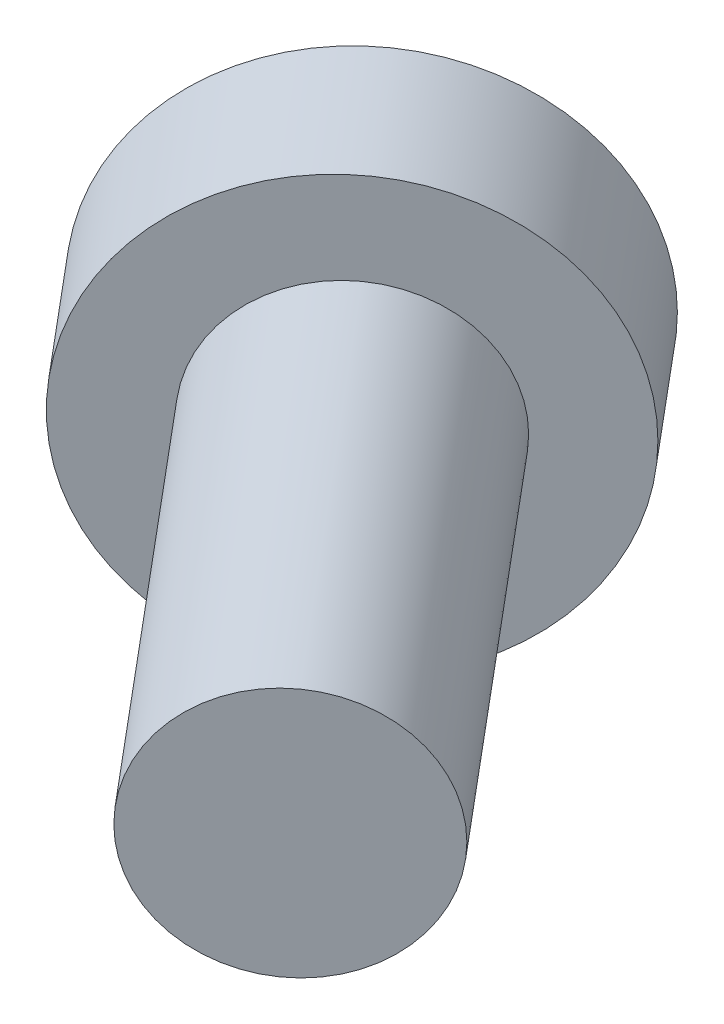
ISO-10303-21;
HEADER;
FILE_DESCRIPTION(('STEP AP214'),'2;1');
FILE_NAME('part.step','',(''),(''),'','','');
FILE_SCHEMA(('AUTOMOTIVE_DESIGN { 1 0 10303 214 1 1 1 1 }'));
ENDSEC;
DATA;
#1=APPLICATION_CONTEXT('core data for automotive mechanical design processes');
#2=APPLICATION_PROTOCOL_DEFINITION('international standard','automotive_design',2000,#1);
#3=PRODUCT_CONTEXT('',#1,'mechanical');
#4=PRODUCT('Part','Part','',(#3));
#5=PRODUCT_RELATED_PRODUCT_CATEGORY('part','',(#4));
#6=PRODUCT_DEFINITION_FORMATION('','',#4);
#7=PRODUCT_DEFINITION_CONTEXT('part definition',#1,'design');
#8=PRODUCT_DEFINITION('design','',#6,#7);
#9=PRODUCT_DEFINITION_SHAPE('','',#8);
#10=(LENGTH_UNIT() NAMED_UNIT(*) SI_UNIT(.MILLI.,.METRE.));
#11=(NAMED_UNIT(*) PLANE_ANGLE_UNIT() SI_UNIT($,.RADIAN.));
#12=(NAMED_UNIT(*) SI_UNIT($,.STERADIAN.) SOLID_ANGLE_UNIT());
#13=UNCERTAINTY_MEASURE_WITH_UNIT(LENGTH_MEASURE(1.E-05),#10,'distance_accuracy_value','');
#14=(GEOMETRIC_REPRESENTATION_CONTEXT(3) GLOBAL_UNCERTAINTY_ASSIGNED_CONTEXT((#13)) GLOBAL_UNIT_ASSIGNED_CONTEXT((#10,
#11,#12)) REPRESENTATION_CONTEXT('',''));
#15=CARTESIAN_POINT('',(0.,0.,0.));
#16=DIRECTION('',(0.,0.,1.));
#17=DIRECTION('',(1.,0.,0.));
#18=AXIS2_PLACEMENT_3D('',#15,#16,#17);
#19=CARTESIAN_POINT('',(193.97681389666,0.,177.99890960736));
#20=DIRECTION('',(0.642787609686799,0.,0.76604444311876));
#21=DIRECTION('',(0.,-1.,0.));
#22=AXIS2_PLACEMENT_3D('',#19,#20,#21);
#23=PLANE('',#22);
#24=CARTESIAN_POINT('',(193.97681389666,0.,177.99890960736));
#25=DIRECTION('',(0.642787609686799,0.,0.76604444311876));
#26=DIRECTION('',(0.76604444311876,0.,-0.642787609686799));
#27=AXIS2_PLACEMENT_3D('',#24,#25,#26);
#28=CIRCLE('',#27,3.175);
#29=CARTESIAN_POINT('',(196.40900500356,0.,175.95805894661));
#30=VERTEX_POINT('',#29);
#31=EDGE_CURVE('E25',#30,#30,#28,.T.);
#32=ORIENTED_EDGE('',*,*,#31,.T.);
#33=EDGE_LOOP('',(#32));
#34=FACE_BOUND('',#33,.T.);
#35=ADVANCED_FACE('F14',(#34),#23,.T.);
#36=CARTESIAN_POINT('',(185.81341125364,0.,168.27014517975));
#37=DIRECTION('',(0.642787609686799,0.,0.76604444311876));
#38=DIRECTION('',(0.76604444311876,0.,-0.642787609686799));
#39=AXIS2_PLACEMENT_3D('',#36,#37,#38);
#40=CYLINDRICAL_SURFACE('',#39,3.175);
#41=ORIENTED_EDGE('',*,*,#31,.F.);
#42=DIRECTION('',(0.642787609686799,0.,0.76604444311876));
#43=VECTOR('',#42,1.);
#44=CARTESIAN_POINT('',(188.24560236054,0.,166.229294519));
#45=LINE('',#44,#43);
#46=CARTESIAN_POINT('',(188.24560236054,0.,166.229294519));
#47=VERTEX_POINT('',#46);
#48=EDGE_CURVE('E9',#47,#30,#45,.T.);
#49=ORIENTED_EDGE('',*,*,#48,.F.);
#50=CARTESIAN_POINT('',(185.81341125364,0.,168.27014517975));
#51=DIRECTION('',(0.642787609686799,0.,0.76604444311876));
#52=DIRECTION('',(0.76604444311876,0.,-0.642787609686799));
#53=AXIS2_PLACEMENT_3D('',#50,#51,#52);
#54=CIRCLE('',#53,3.175);
#55=EDGE_CURVE('E124',#47,#47,#54,.T.);
#56=ORIENTED_EDGE('',*,*,#55,.T.);
#57=ORIENTED_EDGE('',*,*,#48,.T.);
#58=EDGE_LOOP('',(#41,#49,#56,#57));
#59=FACE_BOUND('',#58,.T.);
#60=ADVANCED_FACE('F78',(#59),#40,.T.);
#61=CARTESIAN_POINT('',(183.24226081489,0.,165.20596740728));
#62=DIRECTION('',(0.642787609686799,0.,0.76604444311876));
#63=DIRECTION('',(0.,-1.,0.));
#64=AXIS2_PLACEMENT_3D('',#61,#62,#63);
#65=PLANE('',#64);
#66=CARTESIAN_POINT('',(183.24226081489,0.,165.20596740728));
#67=DIRECTION('',(0.642787609686799,0.,0.76604444311876));
#68=DIRECTION('',(0.76604444311876,0.,-0.642787609686799));
#69=AXIS2_PLACEMENT_3D('',#66,#67,#68);
#70=CIRCLE('',#69,5.5);
#71=CARTESIAN_POINT('',(187.45550525205,0.,161.670635554));
#72=VERTEX_POINT('',#71);
#73=EDGE_CURVE('E52',#72,#72,#70,.T.);
#74=ORIENTED_EDGE('',*,*,#73,.F.);
#75=EDGE_LOOP('',(#74));
#76=FACE_BOUND('',#75,.T.);
#77=ADVANCED_FACE('F69',(#76),#65,.F.);
#78=CARTESIAN_POINT('',(185.81341125364,0.,168.27014517975));
#79=DIRECTION('',(0.642787609686799,0.,0.76604444311876));
#80=DIRECTION('',(0.,-1.,0.));
#81=AXIS2_PLACEMENT_3D('',#78,#79,#80);
#82=PLANE('',#81);
#83=ORIENTED_EDGE('',*,*,#55,.F.);
#84=EDGE_LOOP('',(#83));
#85=FACE_BOUND('',#84,.T.);
#86=CARTESIAN_POINT('',(185.81341125364,0.,168.27014517975));
#87=DIRECTION('',(0.642787609686799,0.,0.76604444311876));
#88=DIRECTION('',(0.76604444311876,0.,-0.642787609686799));
#89=AXIS2_PLACEMENT_3D('',#86,#87,#88);
#90=CIRCLE('',#89,5.5);
#91=CARTESIAN_POINT('',(190.0266556908,0.,164.73481332648));
#92=VERTEX_POINT('',#91);
#93=EDGE_CURVE('E18',#92,#92,#90,.T.);
#94=ORIENTED_EDGE('',*,*,#93,.T.);
#95=EDGE_LOOP('',(#94));
#96=FACE_BOUND('',#95,.T.);
#97=ADVANCED_FACE('F56',(#85,#96),#82,.T.);
#98=CARTESIAN_POINT('',(183.24226081489,0.,165.20596740728));
#99=DIRECTION('',(0.642787609686799,0.,0.76604444311876));
#100=DIRECTION('',(0.76604444311876,0.,-0.642787609686799));
#101=AXIS2_PLACEMENT_3D('',#98,#99,#100);
#102=CYLINDRICAL_SURFACE('',#101,5.5);
#103=ORIENTED_EDGE('',*,*,#93,.F.);
#104=DIRECTION('',(0.642787609686799,0.,0.76604444311876));
#105=VECTOR('',#104,1.);
#106=CARTESIAN_POINT('',(187.45550525205,0.,161.670635554));
#107=LINE('',#106,#105);
#108=EDGE_CURVE('E49',#72,#92,#107,.T.);
#109=ORIENTED_EDGE('',*,*,#108,.F.);
#110=ORIENTED_EDGE('',*,*,#73,.T.);
#111=ORIENTED_EDGE('',*,*,#108,.T.);
#112=EDGE_LOOP('',(#103,#109,#110,#111));
#113=FACE_BOUND('',#112,.T.);
#114=ADVANCED_FACE('F16',(#113),#102,.T.);
#115=CLOSED_SHELL('',(#35,#60,#77,#97,#114));
#116=MANIFOLD_SOLID_BREP('B1',#115);
#117=ADVANCED_BREP_SHAPE_REPRESENTATION('',(#18,#116),#14);
#118=SHAPE_DEFINITION_REPRESENTATION(#9,#117);
ENDSEC;
END-ISO-10303-21;
